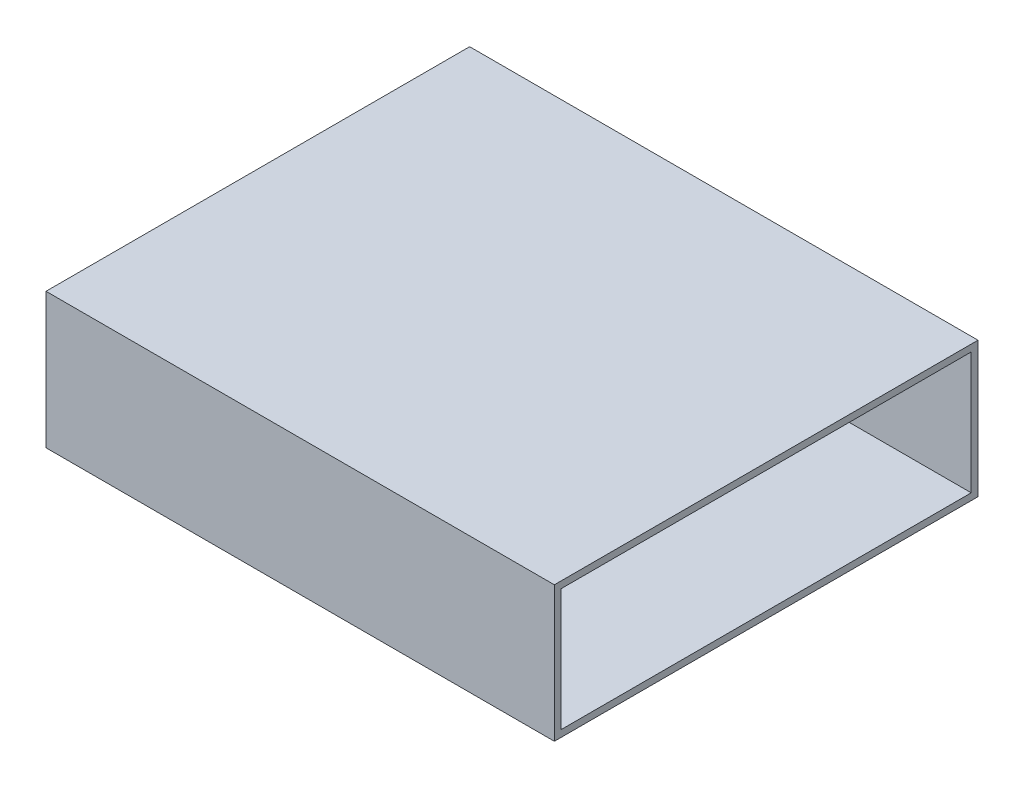
ISO-10303-21;
HEADER;
FILE_DESCRIPTION(('STEP AP214'),'2;1');
FILE_NAME('part.step','',(''),(''),'','','');
FILE_SCHEMA(('AUTOMOTIVE_DESIGN { 1 0 10303 214 1 1 1 1 }'));
ENDSEC;
DATA;
#1=APPLICATION_CONTEXT('core data for automotive mechanical design processes');
#2=APPLICATION_PROTOCOL_DEFINITION('international standard','automotive_design',2000,#1);
#3=PRODUCT_CONTEXT('',#1,'mechanical');
#4=PRODUCT('Part','Part','',(#3));
#5=PRODUCT_RELATED_PRODUCT_CATEGORY('part','',(#4));
#6=PRODUCT_DEFINITION_FORMATION('','',#4);
#7=PRODUCT_DEFINITION_CONTEXT('part definition',#1,'design');
#8=PRODUCT_DEFINITION('design','',#6,#7);
#9=PRODUCT_DEFINITION_SHAPE('','',#8);
#10=(LENGTH_UNIT() NAMED_UNIT(*) SI_UNIT(.MILLI.,.METRE.));
#11=(NAMED_UNIT(*) PLANE_ANGLE_UNIT() SI_UNIT($,.RADIAN.));
#12=(NAMED_UNIT(*) SI_UNIT($,.STERADIAN.) SOLID_ANGLE_UNIT());
#13=UNCERTAINTY_MEASURE_WITH_UNIT(LENGTH_MEASURE(1.E-05),#10,'distance_accuracy_value','');
#14=(GEOMETRIC_REPRESENTATION_CONTEXT(3) GLOBAL_UNCERTAINTY_ASSIGNED_CONTEXT((#13)) GLOBAL_UNIT_ASSIGNED_CONTEXT((#10,
#11,#12)) REPRESENTATION_CONTEXT('',''));
#15=CARTESIAN_POINT('',(0.,0.,0.));
#16=DIRECTION('',(0.,0.,1.));
#17=DIRECTION('',(1.,0.,0.));
#18=AXIS2_PLACEMENT_3D('',#15,#16,#17);
#19=CARTESIAN_POINT('',(-150.,-40.,-125.));
#20=DIRECTION('',(0.,0.,-1.));
#21=DIRECTION('',(-1.,0.,0.));
#22=AXIS2_PLACEMENT_3D('',#19,#20,#21);
#23=PLANE('',#22);
#24=DIRECTION('',(1.,0.,0.));
#25=VECTOR('',#24,1.);
#26=CARTESIAN_POINT('',(-150.,40.,-125.));
#27=LINE('',#26,#25);
#28=CARTESIAN_POINT('',(-150.,40.,-125.));
#29=VERTEX_POINT('',#28);
#30=CARTESIAN_POINT('',(150.,40.,-125.));
#31=VERTEX_POINT('',#30);
#32=EDGE_CURVE('E36',#29,#31,#27,.T.);
#33=ORIENTED_EDGE('',*,*,#32,.T.);
#34=DIRECTION('',(0.,1.,0.));
#35=VECTOR('',#34,1.);
#36=CARTESIAN_POINT('',(150.,-40.,-125.));
#37=LINE('',#36,#35);
#38=CARTESIAN_POINT('',(150.,-40.,-125.));
#39=VERTEX_POINT('',#38);
#40=EDGE_CURVE('E128',#39,#31,#37,.T.);
#41=ORIENTED_EDGE('',*,*,#40,.F.);
#42=DIRECTION('',(1.,0.,0.));
#43=VECTOR('',#42,1.);
#44=CARTESIAN_POINT('',(-150.,-40.,-125.));
#45=LINE('',#44,#43);
#46=CARTESIAN_POINT('',(-150.,-40.,-125.));
#47=VERTEX_POINT('',#46);
#48=EDGE_CURVE('E11',#47,#39,#45,.T.);
#49=ORIENTED_EDGE('',*,*,#48,.F.);
#50=DIRECTION('',(0.,1.,0.));
#51=VECTOR('',#50,1.);
#52=CARTESIAN_POINT('',(-150.,-40.,-125.));
#53=LINE('',#52,#51);
#54=EDGE_CURVE('E147',#47,#29,#53,.T.);
#55=ORIENTED_EDGE('',*,*,#54,.T.);
#56=EDGE_LOOP('',(#33,#41,#49,#55));
#57=FACE_BOUND('',#56,.T.);
#58=ADVANCED_FACE('F33',(#57),#23,.T.);
#59=CARTESIAN_POINT('',(-150.,-40.,125.));
#60=DIRECTION('',(0.,-1.,0.));
#61=DIRECTION('',(0.,0.,-1.));
#62=AXIS2_PLACEMENT_3D('',#59,#60,#61);
#63=PLANE('',#62);
#64=ORIENTED_EDGE('',*,*,#48,.T.);
#65=DIRECTION('',(0.,0.,-1.));
#66=VECTOR('',#65,1.);
#67=CARTESIAN_POINT('',(150.,-40.,125.));
#68=LINE('',#67,#66);
#69=CARTESIAN_POINT('',(150.,-40.,125.));
#70=VERTEX_POINT('',#69);
#71=EDGE_CURVE('E137',#70,#39,#68,.T.);
#72=ORIENTED_EDGE('',*,*,#71,.F.);
#73=DIRECTION('',(1.,0.,0.));
#74=VECTOR('',#73,1.);
#75=CARTESIAN_POINT('',(-150.,-40.,125.));
#76=LINE('',#75,#74);
#77=CARTESIAN_POINT('',(-150.,-40.,125.));
#78=VERTEX_POINT('',#77);
#79=EDGE_CURVE('E41',#78,#70,#76,.T.);
#80=ORIENTED_EDGE('',*,*,#79,.F.);
#81=DIRECTION('',(0.,0.,-1.));
#82=VECTOR('',#81,1.);
#83=CARTESIAN_POINT('',(-150.,-40.,125.));
#84=LINE('',#83,#82);
#85=EDGE_CURVE('E158',#78,#47,#84,.T.);
#86=ORIENTED_EDGE('',*,*,#85,.T.);
#87=EDGE_LOOP('',(#64,#72,#80,#86));
#88=FACE_BOUND('',#87,.T.);
#89=ADVANCED_FACE('F170',(#88),#63,.T.);
#90=CARTESIAN_POINT('',(-150.,-40.,125.));
#91=DIRECTION('',(0.,0.,1.));
#92=DIRECTION('',(1.,0.,0.));
#93=AXIS2_PLACEMENT_3D('',#90,#91,#92);
#94=PLANE('',#93);
#95=ORIENTED_EDGE('',*,*,#79,.T.);
#96=DIRECTION('',(0.,-1.,0.));
#97=VECTOR('',#96,1.);
#98=CARTESIAN_POINT('',(150.,-40.,125.));
#99=LINE('',#98,#97);
#100=CARTESIAN_POINT('',(150.,40.,125.));
#101=VERTEX_POINT('',#100);
#102=EDGE_CURVE('E134',#101,#70,#99,.T.);
#103=ORIENTED_EDGE('',*,*,#102,.F.);
#104=DIRECTION('',(1.,0.,0.));
#105=VECTOR('',#104,1.);
#106=CARTESIAN_POINT('',(-150.,40.,125.));
#107=LINE('',#106,#105);
#108=CARTESIAN_POINT('',(-150.,40.,125.));
#109=VERTEX_POINT('',#108);
#110=EDGE_CURVE('E161',#109,#101,#107,.T.);
#111=ORIENTED_EDGE('',*,*,#110,.F.);
#112=DIRECTION('',(0.,-1.,0.));
#113=VECTOR('',#112,1.);
#114=CARTESIAN_POINT('',(-150.,-40.,125.));
#115=LINE('',#114,#113);
#116=EDGE_CURVE('E155',#109,#78,#115,.T.);
#117=ORIENTED_EDGE('',*,*,#116,.T.);
#118=EDGE_LOOP('',(#95,#103,#111,#117));
#119=FACE_BOUND('',#118,.T.);
#120=ADVANCED_FACE('F176',(#119),#94,.T.);
#121=CARTESIAN_POINT('',(-150.,40.,125.));
#122=DIRECTION('',(0.,1.,0.));
#123=DIRECTION('',(0.,0.,1.));
#124=AXIS2_PLACEMENT_3D('',#121,#122,#123);
#125=PLANE('',#124);
#126=ORIENTED_EDGE('',*,*,#110,.T.);
#127=DIRECTION('',(0.,0.,1.));
#128=VECTOR('',#127,1.);
#129=CARTESIAN_POINT('',(150.,40.,125.));
#130=LINE('',#129,#128);
#131=EDGE_CURVE('E131',#31,#101,#130,.T.);
#132=ORIENTED_EDGE('',*,*,#131,.F.);
#133=ORIENTED_EDGE('',*,*,#32,.F.);
#134=DIRECTION('',(0.,0.,1.));
#135=VECTOR('',#134,1.);
#136=CARTESIAN_POINT('',(-150.,40.,125.));
#137=LINE('',#136,#135);
#138=EDGE_CURVE('E152',#29,#109,#137,.T.);
#139=ORIENTED_EDGE('',*,*,#138,.T.);
#140=EDGE_LOOP('',(#126,#132,#133,#139));
#141=FACE_BOUND('',#140,.T.);
#142=ADVANCED_FACE('F165',(#141),#125,.T.);
#143=CARTESIAN_POINT('',(-150.,0.,0.));
#144=DIRECTION('',(-1.,0.,0.));
#145=DIRECTION('',(0.,0.,1.));
#146=AXIS2_PLACEMENT_3D('',#143,#144,#145);
#147=PLANE('',#146);
#148=DIRECTION('',(0.,1.,0.));
#149=VECTOR('',#148,1.);
#150=CARTESIAN_POINT('',(-150.,-36.,-121.));
#151=LINE('',#150,#149);
#152=CARTESIAN_POINT('',(-150.,-36.,-121.));
#153=VERTEX_POINT('',#152);
#154=CARTESIAN_POINT('',(-150.,36.,-121.));
#155=VERTEX_POINT('',#154);
#156=EDGE_CURVE('E140',#153,#155,#151,.T.);
#157=ORIENTED_EDGE('',*,*,#156,.T.);
#158=DIRECTION('',(0.,0.,1.));
#159=VECTOR('',#158,1.);
#160=CARTESIAN_POINT('',(-150.,36.,121.));
#161=LINE('',#160,#159);
#162=CARTESIAN_POINT('',(-150.,36.,121.));
#163=VERTEX_POINT('',#162);
#164=EDGE_CURVE('E105',#155,#163,#161,.T.);
#165=ORIENTED_EDGE('',*,*,#164,.T.);
#166=DIRECTION('',(0.,-1.,0.));
#167=VECTOR('',#166,1.);
#168=CARTESIAN_POINT('',(-150.,-36.,121.));
#169=LINE('',#168,#167);
#170=CARTESIAN_POINT('',(-150.,-36.,121.));
#171=VERTEX_POINT('',#170);
#172=EDGE_CURVE('E49',#163,#171,#169,.T.);
#173=ORIENTED_EDGE('',*,*,#172,.T.);
#174=DIRECTION('',(0.,0.,-1.));
#175=VECTOR('',#174,1.);
#176=CARTESIAN_POINT('',(-150.,-36.,121.));
#177=LINE('',#176,#175);
#178=EDGE_CURVE('E110',#171,#153,#177,.T.);
#179=ORIENTED_EDGE('',*,*,#178,.T.);
#180=EDGE_LOOP('',(#157,#165,#173,#179));
#181=FACE_BOUND('',#180,.T.);
#182=ORIENTED_EDGE('',*,*,#54,.F.);
#183=ORIENTED_EDGE('',*,*,#85,.F.);
#184=ORIENTED_EDGE('',*,*,#116,.F.);
#185=ORIENTED_EDGE('',*,*,#138,.F.);
#186=EDGE_LOOP('',(#182,#183,#184,#185));
#187=FACE_BOUND('',#186,.T.);
#188=ADVANCED_FACE('F174',(#181,#187),#147,.T.);
#189=CARTESIAN_POINT('',(-150.,-36.,-121.));
#190=DIRECTION('',(0.,0.,-1.));
#191=DIRECTION('',(-1.,0.,0.));
#192=AXIS2_PLACEMENT_3D('',#189,#190,#191);
#193=PLANE('',#192);
#194=DIRECTION('',(1.,0.,0.));
#195=VECTOR('',#194,1.);
#196=CARTESIAN_POINT('',(-150.,-36.,-121.));
#197=LINE('',#196,#195);
#198=CARTESIAN_POINT('',(150.,-36.,-121.));
#199=VERTEX_POINT('',#198);
#200=EDGE_CURVE('E115',#153,#199,#197,.T.);
#201=ORIENTED_EDGE('',*,*,#200,.T.);
#202=DIRECTION('',(0.,1.,0.));
#203=VECTOR('',#202,1.);
#204=CARTESIAN_POINT('',(150.,-36.,-121.));
#205=LINE('',#204,#203);
#206=CARTESIAN_POINT('',(150.,36.,-121.));
#207=VERTEX_POINT('',#206);
#208=EDGE_CURVE('E113',#199,#207,#205,.T.);
#209=ORIENTED_EDGE('',*,*,#208,.T.);
#210=DIRECTION('',(1.,0.,0.));
#211=VECTOR('',#210,1.);
#212=CARTESIAN_POINT('',(-150.,36.,-121.));
#213=LINE('',#212,#211);
#214=EDGE_CURVE('E98',#155,#207,#213,.T.);
#215=ORIENTED_EDGE('',*,*,#214,.F.);
#216=ORIENTED_EDGE('',*,*,#156,.F.);
#217=EDGE_LOOP('',(#201,#209,#215,#216));
#218=FACE_BOUND('',#217,.T.);
#219=ADVANCED_FACE('F114',(#218),#193,.F.);
#220=CARTESIAN_POINT('',(-150.,-36.,121.));
#221=DIRECTION('',(0.,-1.,0.));
#222=DIRECTION('',(0.,0.,-1.));
#223=AXIS2_PLACEMENT_3D('',#220,#221,#222);
#224=PLANE('',#223);
#225=DIRECTION('',(1.,0.,0.));
#226=VECTOR('',#225,1.);
#227=CARTESIAN_POINT('',(-150.,-36.,121.));
#228=LINE('',#227,#226);
#229=CARTESIAN_POINT('',(150.,-36.,121.));
#230=VERTEX_POINT('',#229);
#231=EDGE_CURVE('E148',#171,#230,#228,.T.);
#232=ORIENTED_EDGE('',*,*,#231,.T.);
#233=DIRECTION('',(0.,0.,-1.));
#234=VECTOR('',#233,1.);
#235=CARTESIAN_POINT('',(150.,-36.,121.));
#236=LINE('',#235,#234);
#237=EDGE_CURVE('E124',#230,#199,#236,.T.);
#238=ORIENTED_EDGE('',*,*,#237,.T.);
#239=ORIENTED_EDGE('',*,*,#200,.F.);
#240=ORIENTED_EDGE('',*,*,#178,.F.);
#241=EDGE_LOOP('',(#232,#238,#239,#240));
#242=FACE_BOUND('',#241,.T.);
#243=ADVANCED_FACE('F219',(#242),#224,.F.);
#244=CARTESIAN_POINT('',(-150.,-36.,121.));
#245=DIRECTION('',(0.,0.,1.));
#246=DIRECTION('',(1.,0.,0.));
#247=AXIS2_PLACEMENT_3D('',#244,#245,#246);
#248=PLANE('',#247);
#249=DIRECTION('',(1.,0.,0.));
#250=VECTOR('',#249,1.);
#251=CARTESIAN_POINT('',(-150.,36.,121.));
#252=LINE('',#251,#250);
#253=CARTESIAN_POINT('',(150.,36.,121.));
#254=VERTEX_POINT('',#253);
#255=EDGE_CURVE('E109',#163,#254,#252,.T.);
#256=ORIENTED_EDGE('',*,*,#255,.T.);
#257=DIRECTION('',(0.,-1.,0.));
#258=VECTOR('',#257,1.);
#259=CARTESIAN_POINT('',(150.,-36.,121.));
#260=LINE('',#259,#258);
#261=EDGE_CURVE('E122',#254,#230,#260,.T.);
#262=ORIENTED_EDGE('',*,*,#261,.T.);
#263=ORIENTED_EDGE('',*,*,#231,.F.);
#264=ORIENTED_EDGE('',*,*,#172,.F.);
#265=EDGE_LOOP('',(#256,#262,#263,#264));
#266=FACE_BOUND('',#265,.T.);
#267=ADVANCED_FACE('F228',(#266),#248,.F.);
#268=CARTESIAN_POINT('',(-150.,36.,121.));
#269=DIRECTION('',(0.,1.,0.));
#270=DIRECTION('',(0.,0.,1.));
#271=AXIS2_PLACEMENT_3D('',#268,#269,#270);
#272=PLANE('',#271);
#273=ORIENTED_EDGE('',*,*,#214,.T.);
#274=DIRECTION('',(0.,0.,1.));
#275=VECTOR('',#274,1.);
#276=CARTESIAN_POINT('',(150.,36.,121.));
#277=LINE('',#276,#275);
#278=EDGE_CURVE('E102',#207,#254,#277,.T.);
#279=ORIENTED_EDGE('',*,*,#278,.T.);
#280=ORIENTED_EDGE('',*,*,#255,.F.);
#281=ORIENTED_EDGE('',*,*,#164,.F.);
#282=EDGE_LOOP('',(#273,#279,#280,#281));
#283=FACE_BOUND('',#282,.T.);
#284=ADVANCED_FACE('F100',(#283),#272,.F.);
#285=CARTESIAN_POINT('',(150.,0.,0.));
#286=DIRECTION('',(-1.,0.,0.));
#287=DIRECTION('',(0.,0.,1.));
#288=AXIS2_PLACEMENT_3D('',#285,#286,#287);
#289=PLANE('',#288);
#290=ORIENTED_EDGE('',*,*,#40,.T.);
#291=ORIENTED_EDGE('',*,*,#131,.T.);
#292=ORIENTED_EDGE('',*,*,#102,.T.);
#293=ORIENTED_EDGE('',*,*,#71,.T.);
#294=EDGE_LOOP('',(#290,#291,#292,#293));
#295=FACE_BOUND('',#294,.T.);
#296=ORIENTED_EDGE('',*,*,#208,.F.);
#297=ORIENTED_EDGE('',*,*,#237,.F.);
#298=ORIENTED_EDGE('',*,*,#261,.F.);
#299=ORIENTED_EDGE('',*,*,#278,.F.);
#300=EDGE_LOOP('',(#296,#297,#298,#299));
#301=FACE_BOUND('',#300,.T.);
#302=ADVANCED_FACE('F120',(#295,#301),#289,.F.);
#303=CLOSED_SHELL('',(#58,#89,#120,#142,#188,#219,#243,#267,#284,#302));
#304=MANIFOLD_SOLID_BREP('B2',#303);
#305=ADVANCED_BREP_SHAPE_REPRESENTATION('',(#18,#304),#14);
#306=SHAPE_DEFINITION_REPRESENTATION(#9,#305);
ENDSEC;
END-ISO-10303-21;
